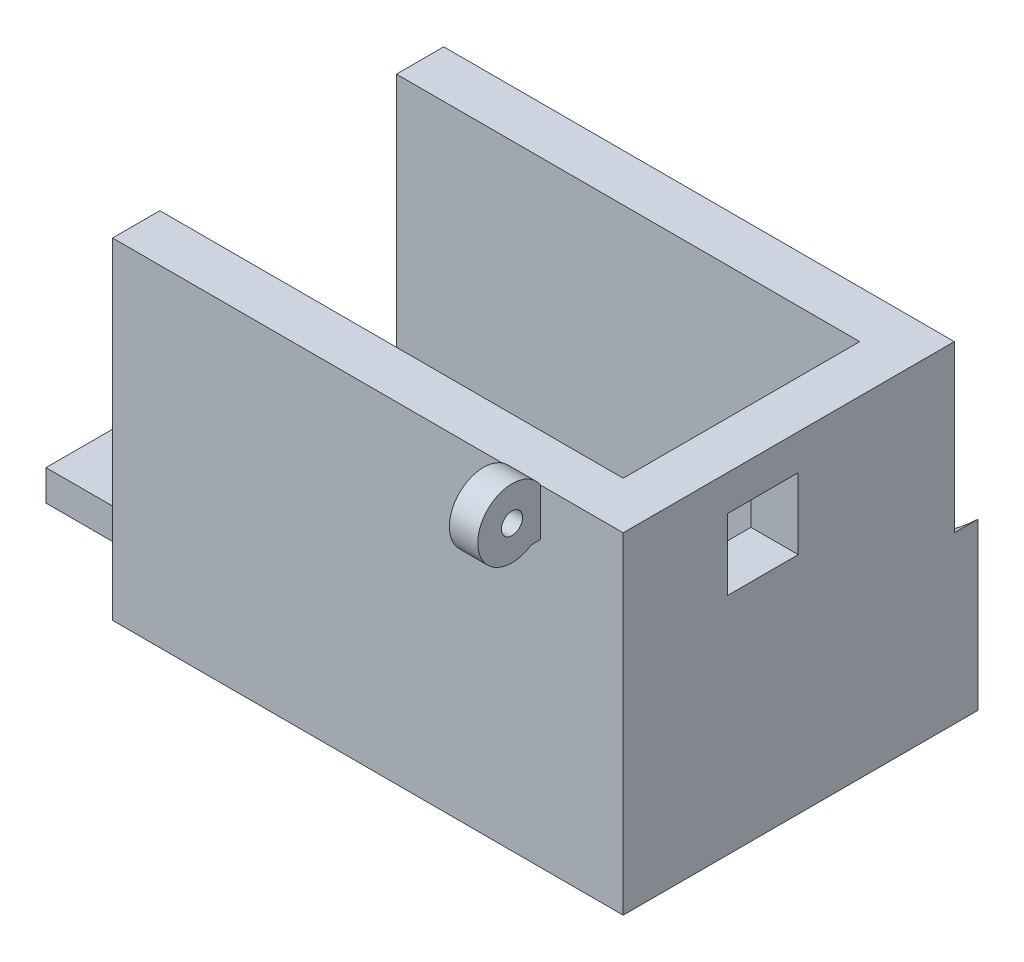
ISO-10303-21;
HEADER;
FILE_DESCRIPTION(('STEP AP214'),'2;1');
FILE_NAME('part.step','',(''),(''),'','','');
FILE_SCHEMA(('AUTOMOTIVE_DESIGN { 1 0 10303 214 1 1 1 1 }'));
ENDSEC;
DATA;
#1=APPLICATION_CONTEXT('core data for automotive mechanical design processes');
#2=APPLICATION_PROTOCOL_DEFINITION('international standard','automotive_design',2000,#1);
#3=PRODUCT_CONTEXT('',#1,'mechanical');
#4=PRODUCT('Part','Part','',(#3));
#5=PRODUCT_RELATED_PRODUCT_CATEGORY('part','',(#4));
#6=PRODUCT_DEFINITION_FORMATION('','',#4);
#7=PRODUCT_DEFINITION_CONTEXT('part definition',#1,'design');
#8=PRODUCT_DEFINITION('design','',#6,#7);
#9=PRODUCT_DEFINITION_SHAPE('','',#8);
#10=(LENGTH_UNIT() NAMED_UNIT(*) SI_UNIT(.MILLI.,.METRE.));
#11=(NAMED_UNIT(*) PLANE_ANGLE_UNIT() SI_UNIT($,.RADIAN.));
#12=(NAMED_UNIT(*) SI_UNIT($,.STERADIAN.) SOLID_ANGLE_UNIT());
#13=UNCERTAINTY_MEASURE_WITH_UNIT(LENGTH_MEASURE(1.E-05),#10,'distance_accuracy_value','');
#14=(GEOMETRIC_REPRESENTATION_CONTEXT(3) GLOBAL_UNCERTAINTY_ASSIGNED_CONTEXT((#13)) GLOBAL_UNIT_ASSIGNED_CONTEXT((#10,
#11,#12)) REPRESENTATION_CONTEXT('',''));
#15=CARTESIAN_POINT('',(0.,0.,0.));
#16=DIRECTION('',(0.,0.,1.));
#17=DIRECTION('',(1.,0.,0.));
#18=AXIS2_PLACEMENT_3D('',#15,#16,#17);
#19=CARTESIAN_POINT('',(162.536585365854,95.,33.3902439024391));
#20=DIRECTION('',(0.,0.,1.));
#21=DIRECTION('',(1.,0.,0.));
#22=AXIS2_PLACEMENT_3D('',#19,#20,#21);
#23=PLANE('',#22);
#24=DIRECTION('',(-1.,0.,0.));
#25=VECTOR('',#24,1.);
#26=CARTESIAN_POINT('',(162.536585365854,125.,33.3902439024391));
#27=LINE('',#26,#25);
#28=CARTESIAN_POINT('',(162.536585365854,125.,33.3902439024391));
#29=VERTEX_POINT('',#28);
#30=CARTESIAN_POINT('',(142.536585365854,125.,33.3902439024391));
#31=VERTEX_POINT('',#30);
#32=EDGE_CURVE('E54',#29,#31,#27,.T.);
#33=ORIENTED_EDGE('',*,*,#32,.F.);
#34=DIRECTION('',(0.,1.,0.));
#35=VECTOR('',#34,1.);
#36=CARTESIAN_POINT('',(162.536585365854,95.,33.3902439024391));
#37=LINE('',#36,#35);
#38=CARTESIAN_POINT('',(162.536585365854,95.,33.3902439024391));
#39=VERTEX_POINT('',#38);
#40=EDGE_CURVE('E195',#39,#29,#37,.T.);
#41=ORIENTED_EDGE('',*,*,#40,.F.);
#42=DIRECTION('',(-1.,0.,0.));
#43=VECTOR('',#42,1.);
#44=CARTESIAN_POINT('',(162.536585365854,95.,33.3902439024391));
#45=LINE('',#44,#43);
#46=CARTESIAN_POINT('',(142.536585365854,95.,33.3902439024391));
#47=VERTEX_POINT('',#46);
#48=EDGE_CURVE('E225',#39,#47,#45,.T.);
#49=ORIENTED_EDGE('',*,*,#48,.T.);
#50=DIRECTION('',(0.,1.,0.));
#51=VECTOR('',#50,1.);
#52=CARTESIAN_POINT('',(142.536585365854,95.,33.3902439024391));
#53=LINE('',#52,#51);
#54=EDGE_CURVE('E216',#47,#31,#53,.T.);
#55=ORIENTED_EDGE('',*,*,#54,.T.);
#56=EDGE_LOOP('',(#33,#41,#49,#55));
#57=FACE_BOUND('',#56,.T.);
#58=ADVANCED_FACE('F39',(#57),#23,.F.);
#59=CARTESIAN_POINT('',(162.536585365854,95.,3.39024390243907));
#60=DIRECTION('',(0.,0.,-1.));
#61=DIRECTION('',(-1.,0.,0.));
#62=AXIS2_PLACEMENT_3D('',#59,#60,#61);
#63=PLANE('',#62);
#64=DIRECTION('',(1.,0.,0.));
#65=VECTOR('',#64,1.);
#66=CARTESIAN_POINT('',(162.536585365854,125.,3.39024390243903));
#67=LINE('',#66,#65);
#68=CARTESIAN_POINT('',(142.536585365854,125.,3.39024390243907));
#69=VERTEX_POINT('',#68);
#70=CARTESIAN_POINT('',(162.536585365854,125.,3.39024390243903));
#71=VERTEX_POINT('',#70);
#72=EDGE_CURVE('E62',#69,#71,#67,.T.);
#73=ORIENTED_EDGE('',*,*,#72,.F.);
#74=DIRECTION('',(0.,-1.,0.));
#75=VECTOR('',#74,1.);
#76=CARTESIAN_POINT('',(142.536585365854,95.,3.39024390243907));
#77=LINE('',#76,#75);
#78=CARTESIAN_POINT('',(142.536585365854,95.,3.39024390243907));
#79=VERTEX_POINT('',#78);
#80=EDGE_CURVE('E221',#69,#79,#77,.T.);
#81=ORIENTED_EDGE('',*,*,#80,.T.);
#82=DIRECTION('',(-1.,0.,0.));
#83=VECTOR('',#82,1.);
#84=CARTESIAN_POINT('',(162.536585365854,95.,3.39024390243907));
#85=LINE('',#84,#83);
#86=CARTESIAN_POINT('',(162.536585365854,95.,3.39024390243907));
#87=VERTEX_POINT('',#86);
#88=EDGE_CURVE('E190',#87,#79,#85,.T.);
#89=ORIENTED_EDGE('',*,*,#88,.F.);
#90=DIRECTION('',(0.,-1.,0.));
#91=VECTOR('',#90,1.);
#92=CARTESIAN_POINT('',(162.536585365854,95.,3.39024390243907));
#93=LINE('',#92,#91);
#94=EDGE_CURVE('E186',#71,#87,#93,.T.);
#95=ORIENTED_EDGE('',*,*,#94,.F.);
#96=EDGE_LOOP('',(#73,#81,#89,#95));
#97=FACE_BOUND('',#96,.T.);
#98=ADVANCED_FACE('F188',(#97),#63,.F.);
#99=CARTESIAN_POINT('',(-203.343414634146,140.,-62.609756097561));
#100=DIRECTION('',(0.,0.,1.));
#101=DIRECTION('',(1.,0.,0.));
#102=AXIS2_PLACEMENT_3D('',#99,#100,#101);
#103=PLANE('',#102);
#104=CARTESIAN_POINT('',(-53.3434146341463,82.32,-62.609756097561));
#105=CARTESIAN_POINT('',(56.1531449954389,198.160876335363,-62.609756097561));
#106=CARTESIAN_POINT('',(74.6422908095103,-13.8218411745904,-62.609756097561));
#107=CARTESIAN_POINT('',(162.536585365854,70.,-62.609756097561));
#108=B_SPLINE_CURVE_WITH_KNOTS('',3,(#104,#105,#106,#107),.UNSPECIFIED.,.F.,.F.,(4,4),(0.,1.),.UNSPECIFIED.);
#109=CARTESIAN_POINT('',(-53.3434146341462,82.32,-62.609756097561));
#110=VERTEX_POINT('',#109);
#111=CARTESIAN_POINT('',(162.536585365854,70.,-62.609756097561));
#112=VERTEX_POINT('',#111);
#113=EDGE_CURVE('E227',#110,#112,#108,.T.);
#114=ORIENTED_EDGE('',*,*,#113,.F.);
#115=DIRECTION('',(0.,1.,0.));
#116=VECTOR('',#115,1.);
#117=CARTESIAN_POINT('',(-53.3434146341462,0.,-62.609756097561));
#118=LINE('',#117,#116);
#119=CARTESIAN_POINT('',(-53.3434146341462,140.,-62.609756097561));
#120=VERTEX_POINT('',#119);
#121=EDGE_CURVE('E383',#110,#120,#118,.T.);
#122=ORIENTED_EDGE('',*,*,#121,.T.);
#123=DIRECTION('',(-1.,0.,0.));
#124=VECTOR('',#123,1.);
#125=CARTESIAN_POINT('',(-203.343414634146,140.,-62.609756097561));
#126=LINE('',#125,#124);
#127=CARTESIAN_POINT('',(162.536585365854,140.,-62.609756097561));
#128=VERTEX_POINT('',#127);
#129=EDGE_CURVE('E453',#128,#120,#126,.T.);
#130=ORIENTED_EDGE('',*,*,#129,.F.);
#131=DIRECTION('',(0.,-1.,0.));
#132=VECTOR('',#131,1.);
#133=CARTESIAN_POINT('',(162.536585365854,140.,-62.609756097561));
#134=LINE('',#133,#132);
#135=EDGE_CURVE('E456',#128,#112,#134,.T.);
#136=ORIENTED_EDGE('',*,*,#135,.T.);
#137=EDGE_LOOP('',(#114,#122,#130,#136));
#138=FACE_BOUND('',#137,.T.);
#139=ADVANCED_FACE('F280',(#138),#103,.F.);
#140=CARTESIAN_POINT('',(-53.3434146341462,0.,77.3902439024391));
#141=DIRECTION('',(1.,0.,0.));
#142=DIRECTION('',(0.,0.,-1.));
#143=AXIS2_PLACEMENT_3D('',#140,#141,#142);
#144=PLANE('',#143);
#145=DIRECTION('',(0.,0.,-1.));
#146=VECTOR('',#145,1.);
#147=CARTESIAN_POINT('',(-53.3434146341462,140.,77.3902439024391));
#148=LINE('',#147,#146);
#149=CARTESIAN_POINT('',(-53.3434146341462,140.,-42.609756097561));
#150=VERTEX_POINT('',#149);
#151=EDGE_CURVE('E372',#150,#120,#148,.T.);
#152=ORIENTED_EDGE('',*,*,#151,.T.);
#153=ORIENTED_EDGE('',*,*,#121,.F.);
#154=DIRECTION('',(0.,0.,1.));
#155=VECTOR('',#154,1.);
#156=CARTESIAN_POINT('',(-53.3434146341463,82.32,-72.609756097561));
#157=LINE('',#156,#155);
#158=CARTESIAN_POINT('',(-53.3434146341463,82.32,-72.609756097561));
#159=VERTEX_POINT('',#158);
#160=EDGE_CURVE('E476',#159,#110,#157,.T.);
#161=ORIENTED_EDGE('',*,*,#160,.F.);
#162=DIRECTION('',(0.,1.,0.));
#163=VECTOR('',#162,1.);
#164=CARTESIAN_POINT('',(-53.3434146341462,0.,-72.609756097561));
#165=LINE('',#164,#163);
#166=CARTESIAN_POINT('',(-53.3434146341462,0.,-72.609756097561));
#167=VERTEX_POINT('',#166);
#168=EDGE_CURVE('E475',#167,#159,#165,.T.);
#169=ORIENTED_EDGE('',*,*,#168,.F.);
#170=DIRECTION('',(0.,0.,-1.));
#171=VECTOR('',#170,1.);
#172=CARTESIAN_POINT('',(-53.3434146341462,0.,77.3902439024391));
#173=LINE('',#172,#171);
#174=CARTESIAN_POINT('',(-53.3434146341462,0.,77.3902439024391));
#175=VERTEX_POINT('',#174);
#176=EDGE_CURVE('E378',#175,#167,#173,.T.);
#177=ORIENTED_EDGE('',*,*,#176,.F.);
#178=DIRECTION('',(0.,1.,0.));
#179=VECTOR('',#178,1.);
#180=CARTESIAN_POINT('',(-53.3434146341462,0.,77.3902439024391));
#181=LINE('',#180,#179);
#182=CARTESIAN_POINT('',(-53.3434146341462,140.,77.3902439024391));
#183=VERTEX_POINT('',#182);
#184=EDGE_CURVE('E380',#175,#183,#181,.T.);
#185=ORIENTED_EDGE('',*,*,#184,.T.);
#186=CARTESIAN_POINT('',(-53.3434146341462,140.,57.390243902439));
#187=VERTEX_POINT('',#186);
#188=EDGE_CURVE('E381',#183,#187,#148,.T.);
#189=ORIENTED_EDGE('',*,*,#188,.T.);
#190=DIRECTION('',(0.,1.,0.));
#191=VECTOR('',#190,1.);
#192=CARTESIAN_POINT('',(-53.3434146341462,30.,57.390243902439));
#193=LINE('',#192,#191);
#194=CARTESIAN_POINT('',(-53.3434146341463,30.,57.390243902439));
#195=VERTEX_POINT('',#194);
#196=EDGE_CURVE('E385',#195,#187,#193,.T.);
#197=ORIENTED_EDGE('',*,*,#196,.F.);
#198=DIRECTION('',(0.,0.,-1.));
#199=VECTOR('',#198,1.);
#200=CARTESIAN_POINT('',(-53.3434146341462,30.,0.));
#201=LINE('',#200,#199);
#202=CARTESIAN_POINT('',(-53.3434146341462,30.,-42.609756097561));
#203=VERTEX_POINT('',#202);
#204=EDGE_CURVE('E12',#195,#203,#201,.T.);
#205=ORIENTED_EDGE('',*,*,#204,.T.);
#206=DIRECTION('',(0.,-1.,0.));
#207=VECTOR('',#206,1.);
#208=CARTESIAN_POINT('',(-53.3434146341462,30.,-42.609756097561));
#209=LINE('',#208,#207);
#210=EDGE_CURVE('E389',#150,#203,#209,.T.);
#211=ORIENTED_EDGE('',*,*,#210,.F.);
#212=EDGE_LOOP('',(#152,#153,#161,#169,#177,#185,#189,#197,#205,#211));
#213=FACE_BOUND('',#212,.T.);
#214=DIRECTION('',(0.,-1.,0.));
#215=VECTOR('',#214,1.);
#216=CARTESIAN_POINT('',(-53.3434146341462,20.,-42.609756097561));
#217=LINE('',#216,#215);
#218=CARTESIAN_POINT('',(-53.3434146341462,20.,-42.609756097561));
#219=VERTEX_POINT('',#218);
#220=CARTESIAN_POINT('',(-53.3434146341462,7.,-42.609756097561));
#221=VERTEX_POINT('',#220);
#222=EDGE_CURVE('E364',#219,#221,#217,.T.);
#223=ORIENTED_EDGE('',*,*,#222,.F.);
#224=DIRECTION('',(0.,0.,-1.));
#225=VECTOR('',#224,1.);
#226=CARTESIAN_POINT('',(-53.3434146341462,20.,-42.609756097561));
#227=LINE('',#226,#225);
#228=CARTESIAN_POINT('',(-53.3434146341462,20.,55.5296286532583));
#229=VERTEX_POINT('',#228);
#230=EDGE_CURVE('E501',#229,#219,#227,.T.);
#231=ORIENTED_EDGE('',*,*,#230,.F.);
#232=DIRECTION('',(0.,1.,0.));
#233=VECTOR('',#232,1.);
#234=CARTESIAN_POINT('',(-53.3434146341462,20.,55.5296286532583));
#235=LINE('',#234,#233);
#236=CARTESIAN_POINT('',(-53.3434146341462,7.,55.5296286532583));
#237=VERTEX_POINT('',#236);
#238=EDGE_CURVE('E363',#237,#229,#235,.T.);
#239=ORIENTED_EDGE('',*,*,#238,.F.);
#240=DIRECTION('',(0.,0.,1.));
#241=VECTOR('',#240,1.);
#242=CARTESIAN_POINT('',(-53.3434146341462,7.,-42.609756097561));
#243=LINE('',#242,#241);
#244=EDGE_CURVE('E355',#221,#237,#243,.T.);
#245=ORIENTED_EDGE('',*,*,#244,.F.);
#246=EDGE_LOOP('',(#223,#231,#239,#245));
#247=FACE_BOUND('',#246,.T.);
#248=ADVANCED_FACE('F277',(#213,#247),#144,.F.);
#249=CARTESIAN_POINT('',(-203.343414634146,140.,77.3902439024391));
#250=DIRECTION('',(0.,0.,-1.));
#251=DIRECTION('',(-1.,0.,0.));
#252=AXIS2_PLACEMENT_3D('',#249,#250,#251);
#253=PLANE('',#252);
#254=DIRECTION('',(1.,0.,0.));
#255=VECTOR('',#254,1.);
#256=CARTESIAN_POINT('',(-203.343414634146,140.,77.3902439024391));
#257=LINE('',#256,#255);
#258=CARTESIAN_POINT('',(115.536585365854,140.,77.3902439024391));
#259=VERTEX_POINT('',#258);
#260=EDGE_CURVE('E448',#183,#259,#257,.T.);
#261=ORIENTED_EDGE('',*,*,#260,.F.);
#262=ORIENTED_EDGE('',*,*,#184,.F.);
#263=DIRECTION('',(1.,0.,0.));
#264=VECTOR('',#263,1.);
#265=CARTESIAN_POINT('',(-203.343414634146,0.,77.3902439024391));
#266=LINE('',#265,#264);
#267=CARTESIAN_POINT('',(162.536585365854,0.,77.3902439024391));
#268=VERTEX_POINT('',#267);
#269=EDGE_CURVE('E445',#175,#268,#266,.T.);
#270=ORIENTED_EDGE('',*,*,#269,.T.);
#271=DIRECTION('',(0.,-1.,0.));
#272=VECTOR('',#271,1.);
#273=CARTESIAN_POINT('',(162.536585365854,140.,77.3902439024391));
#274=LINE('',#273,#272);
#275=CARTESIAN_POINT('',(162.536585365854,140.,77.3902439024391));
#276=VERTEX_POINT('',#275);
#277=EDGE_CURVE('E47',#276,#268,#274,.T.);
#278=ORIENTED_EDGE('',*,*,#277,.F.);
#279=CARTESIAN_POINT('',(127.536585365854,140.,77.3902439024391));
#280=VERTEX_POINT('',#279);
#281=EDGE_CURVE('E451',#280,#276,#257,.T.);
#282=ORIENTED_EDGE('',*,*,#281,.F.);
#283=DIRECTION('',(0.,1.,0.));
#284=VECTOR('',#283,1.);
#285=CARTESIAN_POINT('',(127.536585365854,132.,77.3902439024391));
#286=LINE('',#285,#284);
#287=CARTESIAN_POINT('',(127.536585365854,120.,77.3902439024391));
#288=VERTEX_POINT('',#287);
#289=EDGE_CURVE('E419',#288,#280,#286,.T.);
#290=ORIENTED_EDGE('',*,*,#289,.F.);
#291=DIRECTION('',(1.,0.,0.));
#292=VECTOR('',#291,1.);
#293=CARTESIAN_POINT('',(115.536585365854,120.,77.3902439024391));
#294=LINE('',#293,#292);
#295=CARTESIAN_POINT('',(115.536585365854,120.,77.3902439024391));
#296=VERTEX_POINT('',#295);
#297=EDGE_CURVE('E416',#296,#288,#294,.T.);
#298=ORIENTED_EDGE('',*,*,#297,.F.);
#299=DIRECTION('',(0.,-1.,0.));
#300=VECTOR('',#299,1.);
#301=CARTESIAN_POINT('',(115.536585365854,132.,77.3902439024391));
#302=LINE('',#301,#300);
#303=EDGE_CURVE('E414',#259,#296,#302,.T.);
#304=ORIENTED_EDGE('',*,*,#303,.F.);
#305=EDGE_LOOP('',(#261,#262,#270,#278,#282,#290,#298,#304));
#306=FACE_BOUND('',#305,.T.);
#307=ADVANCED_FACE('F41',(#306),#253,.F.);
#308=CARTESIAN_POINT('',(0.,140.,0.));
#309=DIRECTION('',(0.,1.,0.));
#310=DIRECTION('',(0.,0.,1.));
#311=AXIS2_PLACEMENT_3D('',#308,#309,#310);
#312=PLANE('',#311);
#313=DIRECTION('',(-1.,0.,0.));
#314=VECTOR('',#313,1.);
#315=CARTESIAN_POINT('',(-203.343414634146,140.,-42.609756097561));
#316=LINE('',#315,#314);
#317=CARTESIAN_POINT('',(142.536585365854,140.,-42.609756097561));
#318=VERTEX_POINT('',#317);
#319=EDGE_CURVE('E430',#318,#150,#316,.T.);
#320=ORIENTED_EDGE('',*,*,#319,.F.);
#321=DIRECTION('',(0.,0.,-1.));
#322=VECTOR('',#321,1.);
#323=CARTESIAN_POINT('',(142.536585365854,140.,-42.609756097561));
#324=LINE('',#323,#322);
#325=CARTESIAN_POINT('',(142.536585365854,140.,57.390243902439));
#326=VERTEX_POINT('',#325);
#327=EDGE_CURVE('E438',#326,#318,#324,.T.);
#328=ORIENTED_EDGE('',*,*,#327,.F.);
#329=DIRECTION('',(1.,0.,0.));
#330=VECTOR('',#329,1.);
#331=CARTESIAN_POINT('',(-203.343414634146,140.,57.390243902439));
#332=LINE('',#331,#330);
#333=EDGE_CURVE('E426',#187,#326,#332,.T.);
#334=ORIENTED_EDGE('',*,*,#333,.F.);
#335=ORIENTED_EDGE('',*,*,#188,.F.);
#336=ORIENTED_EDGE('',*,*,#260,.T.);
#337=DIRECTION('',(0.,0.,-1.));
#338=VECTOR('',#337,1.);
#339=CARTESIAN_POINT('',(115.536585365854,140.,0.));
#340=LINE('',#339,#338);
#341=CARTESIAN_POINT('',(115.536585365854,140.,77.3088491154122));
#342=VERTEX_POINT('',#341);
#343=EDGE_CURVE('E406',#259,#342,#340,.T.);
#344=ORIENTED_EDGE('',*,*,#343,.T.);
#345=DIRECTION('',(1.,0.,0.));
#346=VECTOR('',#345,1.);
#347=CARTESIAN_POINT('',(115.536585365854,140.,77.3088491154122));
#348=LINE('',#347,#346);
#349=CARTESIAN_POINT('',(127.536585365854,140.,77.3088491154122));
#350=VERTEX_POINT('',#349);
#351=EDGE_CURVE('E411',#350,#342,#348,.F.);
#352=ORIENTED_EDGE('',*,*,#351,.F.);
#353=DIRECTION('',(0.,0.,-1.));
#354=VECTOR('',#353,1.);
#355=CARTESIAN_POINT('',(127.536585365854,140.,0.));
#356=LINE('',#355,#354);
#357=EDGE_CURVE('E401',#280,#350,#356,.T.);
#358=ORIENTED_EDGE('',*,*,#357,.F.);
#359=ORIENTED_EDGE('',*,*,#281,.T.);
#360=DIRECTION('',(0.,0.,-1.));
#361=VECTOR('',#360,1.);
#362=CARTESIAN_POINT('',(162.536585365854,140.,-62.609756097561));
#363=LINE('',#362,#361);
#364=EDGE_CURVE('E450',#276,#128,#363,.T.);
#365=ORIENTED_EDGE('',*,*,#364,.T.);
#366=ORIENTED_EDGE('',*,*,#129,.T.);
#367=ORIENTED_EDGE('',*,*,#151,.F.);
#368=EDGE_LOOP('',(#320,#328,#334,#335,#336,#344,#352,#358,#359,#365,#366,#367));
#369=FACE_BOUND('',#368,.T.);
#370=ADVANCED_FACE('F318',(#369),#312,.T.);
#371=CARTESIAN_POINT('',(162.536585365854,140.,-62.609756097561));
#372=DIRECTION('',(-1.,0.,0.));
#373=DIRECTION('',(0.,0.,1.));
#374=AXIS2_PLACEMENT_3D('',#371,#372,#373);
#375=PLANE('',#374);
#376=ORIENTED_EDGE('',*,*,#40,.T.);
#377=DIRECTION('',(0.,0.,-1.));
#378=VECTOR('',#377,1.);
#379=CARTESIAN_POINT('',(162.536585365854,125.,43.390243902439));
#380=LINE('',#379,#378);
#381=EDGE_CURVE('E198',#29,#71,#380,.T.);
#382=ORIENTED_EDGE('',*,*,#381,.T.);
#383=ORIENTED_EDGE('',*,*,#94,.T.);
#384=DIRECTION('',(0.,0.,1.));
#385=VECTOR('',#384,1.);
#386=CARTESIAN_POINT('',(162.536585365854,95.,3.39024390243907));
#387=LINE('',#386,#385);
#388=EDGE_CURVE('E194',#87,#39,#387,.T.);
#389=ORIENTED_EDGE('',*,*,#388,.T.);
#390=EDGE_LOOP('',(#376,#382,#383,#389));
#391=FACE_BOUND('',#390,.T.);
#392=ORIENTED_EDGE('',*,*,#135,.F.);
#393=ORIENTED_EDGE('',*,*,#364,.F.);
#394=ORIENTED_EDGE('',*,*,#277,.T.);
#395=DIRECTION('',(0.,0.,-1.));
#396=VECTOR('',#395,1.);
#397=CARTESIAN_POINT('',(162.536585365854,0.,-62.609756097561));
#398=LINE('',#397,#396);
#399=CARTESIAN_POINT('',(162.536585365854,0.,-72.609756097561));
#400=VERTEX_POINT('',#399);
#401=EDGE_CURVE('E458',#268,#400,#398,.T.);
#402=ORIENTED_EDGE('',*,*,#401,.T.);
#403=DIRECTION('',(0.,-1.,0.));
#404=VECTOR('',#403,1.);
#405=CARTESIAN_POINT('',(162.536585365854,70.,-72.609756097561));
#406=LINE('',#405,#404);
#407=CARTESIAN_POINT('',(162.536585365854,70.,-72.609756097561));
#408=VERTEX_POINT('',#407);
#409=EDGE_CURVE('E235',#408,#400,#406,.T.);
#410=ORIENTED_EDGE('',*,*,#409,.F.);
#411=DIRECTION('',(0.,0.,1.));
#412=VECTOR('',#411,1.);
#413=CARTESIAN_POINT('',(162.536585365854,70.,-72.609756097561));
#414=LINE('',#413,#412);
#415=EDGE_CURVE('E488',#408,#112,#414,.T.);
#416=ORIENTED_EDGE('',*,*,#415,.T.);
#417=EDGE_LOOP('',(#392,#393,#394,#402,#410,#416));
#418=FACE_BOUND('',#417,.T.);
#419=ADVANCED_FACE('F199',(#391,#418),#375,.F.);
#420=CARTESIAN_POINT('',(0.,0.,0.));
#421=DIRECTION('',(0.,1.,0.));
#422=DIRECTION('',(0.,0.,1.));
#423=AXIS2_PLACEMENT_3D('',#420,#421,#422);
#424=PLANE('',#423);
#425=CARTESIAN_POINT('',(10.5365853658537,0.,7.39024390243905));
#426=DIRECTION('',(0.,1.,0.));
#427=DIRECTION('',(0.,0.,1.));
#428=AXIS2_PLACEMENT_3D('',#425,#426,#427);
#429=CIRCLE('',#428,3.);
#430=CARTESIAN_POINT('',(10.5365853658537,0.,10.390243902439));
#431=VERTEX_POINT('',#430);
#432=EDGE_CURVE('E492',#431,#431,#429,.T.);
#433=ORIENTED_EDGE('',*,*,#432,.T.);
#434=EDGE_LOOP('',(#433));
#435=FACE_BOUND('',#434,.T.);
#436=ORIENTED_EDGE('',*,*,#269,.F.);
#437=ORIENTED_EDGE('',*,*,#176,.T.);
#438=DIRECTION('',(-1.,0.,0.));
#439=VECTOR('',#438,1.);
#440=CARTESIAN_POINT('',(162.536585365854,0.,-72.609756097561));
#441=LINE('',#440,#439);
#442=EDGE_CURVE('E472',#400,#167,#441,.T.);
#443=ORIENTED_EDGE('',*,*,#442,.F.);
#444=ORIENTED_EDGE('',*,*,#401,.F.);
#445=EDGE_LOOP('',(#436,#437,#443,#444));
#446=FACE_BOUND('',#445,.T.);
#447=ADVANCED_FACE('F310',(#435,#446),#424,.F.);
#448=CARTESIAN_POINT('',(-203.343414634146,30.,-42.609756097561));
#449=DIRECTION('',(0.,0.,-1.));
#450=DIRECTION('',(-1.,0.,0.));
#451=AXIS2_PLACEMENT_3D('',#448,#449,#450);
#452=PLANE('',#451);
#453=ORIENTED_EDGE('',*,*,#319,.T.);
#454=ORIENTED_EDGE('',*,*,#210,.T.);
#455=DIRECTION('',(-1.,0.,0.));
#456=VECTOR('',#455,1.);
#457=CARTESIAN_POINT('',(-203.343414634146,30.,-42.609756097561));
#458=LINE('',#457,#456);
#459=CARTESIAN_POINT('',(142.536585365854,30.,-42.609756097561));
#460=VERTEX_POINT('',#459);
#461=EDGE_CURVE('E433',#460,#203,#458,.T.);
#462=ORIENTED_EDGE('',*,*,#461,.F.);
#463=DIRECTION('',(0.,1.,0.));
#464=VECTOR('',#463,1.);
#465=CARTESIAN_POINT('',(142.536585365854,30.,-42.609756097561));
#466=LINE('',#465,#464);
#467=EDGE_CURVE('E442',#460,#318,#466,.T.);
#468=ORIENTED_EDGE('',*,*,#467,.T.);
#469=EDGE_LOOP('',(#453,#454,#462,#468));
#470=FACE_BOUND('',#469,.T.);
#471=ADVANCED_FACE('F306',(#470),#452,.F.);
#472=CARTESIAN_POINT('',(142.536585365854,30.,-42.609756097561));
#473=DIRECTION('',(1.,0.,0.));
#474=DIRECTION('',(0.,0.,-1.));
#475=AXIS2_PLACEMENT_3D('',#472,#473,#474);
#476=PLANE('',#475);
#477=DIRECTION('',(0.,0.,-1.));
#478=VECTOR('',#477,1.);
#479=CARTESIAN_POINT('',(142.536585365854,125.,43.390243902439));
#480=LINE('',#479,#478);
#481=EDGE_CURVE('E202',#31,#69,#480,.T.);
#482=ORIENTED_EDGE('',*,*,#481,.F.);
#483=ORIENTED_EDGE('',*,*,#54,.F.);
#484=DIRECTION('',(0.,0.,1.));
#485=VECTOR('',#484,1.);
#486=CARTESIAN_POINT('',(142.536585365854,95.,3.39024390243907));
#487=LINE('',#486,#485);
#488=EDGE_CURVE('E217',#79,#47,#487,.T.);
#489=ORIENTED_EDGE('',*,*,#488,.F.);
#490=ORIENTED_EDGE('',*,*,#80,.F.);
#491=EDGE_LOOP('',(#482,#483,#489,#490));
#492=FACE_BOUND('',#491,.T.);
#493=ORIENTED_EDGE('',*,*,#327,.T.);
#494=ORIENTED_EDGE('',*,*,#467,.F.);
#495=DIRECTION('',(0.,0.,-1.));
#496=VECTOR('',#495,1.);
#497=CARTESIAN_POINT('',(142.536585365854,30.,-42.609756097561));
#498=LINE('',#497,#496);
#499=CARTESIAN_POINT('',(142.536585365854,30.,57.390243902439));
#500=VERTEX_POINT('',#499);
#501=EDGE_CURVE('E429',#500,#460,#498,.T.);
#502=ORIENTED_EDGE('',*,*,#501,.F.);
#503=DIRECTION('',(0.,1.,0.));
#504=VECTOR('',#503,1.);
#505=CARTESIAN_POINT('',(142.536585365854,30.,57.390243902439));
#506=LINE('',#505,#504);
#507=EDGE_CURVE('E436',#500,#326,#506,.T.);
#508=ORIENTED_EDGE('',*,*,#507,.T.);
#509=EDGE_LOOP('',(#493,#494,#502,#508));
#510=FACE_BOUND('',#509,.T.);
#511=ADVANCED_FACE('F309',(#492,#510),#476,.F.);
#512=CARTESIAN_POINT('',(-203.343414634146,30.,57.390243902439));
#513=DIRECTION('',(0.,0.,1.));
#514=DIRECTION('',(1.,0.,0.));
#515=AXIS2_PLACEMENT_3D('',#512,#513,#514);
#516=PLANE('',#515);
#517=DIRECTION('',(1.,0.,0.));
#518=VECTOR('',#517,1.);
#519=CARTESIAN_POINT('',(-203.343414634146,30.,57.390243902439));
#520=LINE('',#519,#518);
#521=EDGE_CURVE('E427',#195,#500,#520,.T.);
#522=ORIENTED_EDGE('',*,*,#521,.F.);
#523=ORIENTED_EDGE('',*,*,#196,.T.);
#524=ORIENTED_EDGE('',*,*,#333,.T.);
#525=ORIENTED_EDGE('',*,*,#507,.F.);
#526=EDGE_LOOP('',(#522,#523,#524,#525));
#527=FACE_BOUND('',#526,.T.);
#528=ADVANCED_FACE('F304',(#527),#516,.F.);
#529=CARTESIAN_POINT('',(0.,30.,0.));
#530=DIRECTION('',(0.,1.,0.));
#531=DIRECTION('',(0.,0.,1.));
#532=AXIS2_PLACEMENT_3D('',#529,#530,#531);
#533=PLANE('',#532);
#534=ORIENTED_EDGE('',*,*,#204,.F.);
#535=ORIENTED_EDGE('',*,*,#521,.T.);
#536=ORIENTED_EDGE('',*,*,#501,.T.);
#537=ORIENTED_EDGE('',*,*,#461,.T.);
#538=EDGE_LOOP('',(#534,#535,#536,#537));
#539=FACE_BOUND('',#538,.T.);
#540=ADVANCED_FACE('F300',(#539),#533,.T.);
#541=CARTESIAN_POINT('',(115.536585365854,132.,87.3902439024391));
#542=DIRECTION('',(1.,0.,0.));
#543=DIRECTION('',(0.,0.,-1.));
#544=AXIS2_PLACEMENT_3D('',#541,#542,#543);
#545=PLANE('',#544);
#546=DIRECTION('',(0.,0.,-1.));
#547=VECTOR('',#546,1.);
#548=CARTESIAN_POINT('',(115.536585365854,120.,87.3902439024391));
#549=LINE('',#548,#547);
#550=CARTESIAN_POINT('',(115.536585365854,120.,81.2686615443022));
#551=VERTEX_POINT('',#550);
#552=EDGE_CURVE('E423',#551,#296,#549,.T.);
#553=ORIENTED_EDGE('',*,*,#552,.F.);
#554=CARTESIAN_POINT('',(115.536585365854,132.,89.3902439024391));
#555=DIRECTION('',(1.,0.,0.));
#556=DIRECTION('',(0.,0.,-1.));
#557=AXIS2_PLACEMENT_3D('',#554,#555,#556);
#558=CIRCLE('',#557,14.49);
#559=EDGE_CURVE('E399',#342,#551,#558,.T.);
#560=ORIENTED_EDGE('',*,*,#559,.F.);
#561=ORIENTED_EDGE('',*,*,#343,.F.);
#562=ORIENTED_EDGE('',*,*,#303,.T.);
#563=EDGE_LOOP('',(#553,#560,#561,#562));
#564=FACE_BOUND('',#563,.T.);
#565=CARTESIAN_POINT('',(115.536585365854,132.,89.3902439024391));
#566=DIRECTION('',(1.,0.,0.));
#567=DIRECTION('',(0.,0.,-1.));
#568=AXIS2_PLACEMENT_3D('',#565,#566,#567);
#569=CIRCLE('',#568,4.48999999999999);
#570=CARTESIAN_POINT('',(115.536585365854,132.,84.9002439024391));
#571=VERTEX_POINT('',#570);
#572=EDGE_CURVE('E393',#571,#571,#569,.T.);
#573=ORIENTED_EDGE('',*,*,#572,.T.);
#574=EDGE_LOOP('',(#573));
#575=FACE_BOUND('',#574,.T.);
#576=ADVANCED_FACE('F296',(#564,#575),#545,.F.);
#577=CARTESIAN_POINT('',(115.536585365854,120.,87.3902439024391));
#578=DIRECTION('',(0.,1.,0.));
#579=DIRECTION('',(0.,0.,1.));
#580=AXIS2_PLACEMENT_3D('',#577,#578,#579);
#581=PLANE('',#580);
#582=DIRECTION('',(0.,0.,-1.));
#583=VECTOR('',#582,1.);
#584=CARTESIAN_POINT('',(127.536585365854,120.,87.3902439024391));
#585=LINE('',#584,#583);
#586=CARTESIAN_POINT('',(127.536585365854,120.,81.2686615443022));
#587=VERTEX_POINT('',#586);
#588=EDGE_CURVE('E421',#587,#288,#585,.T.);
#589=ORIENTED_EDGE('',*,*,#588,.F.);
#590=DIRECTION('',(1.,0.,0.));
#591=VECTOR('',#590,1.);
#592=CARTESIAN_POINT('',(115.536585365854,120.,81.2686615443022));
#593=LINE('',#592,#591);
#594=EDGE_CURVE('E408',#587,#551,#593,.F.);
#595=ORIENTED_EDGE('',*,*,#594,.T.);
#596=ORIENTED_EDGE('',*,*,#552,.T.);
#597=ORIENTED_EDGE('',*,*,#297,.T.);
#598=EDGE_LOOP('',(#589,#595,#596,#597));
#599=FACE_BOUND('',#598,.T.);
#600=ADVANCED_FACE('F292',(#599),#581,.F.);
#601=CARTESIAN_POINT('',(127.536585365854,132.,87.3902439024391));
#602=DIRECTION('',(-1.,0.,0.));
#603=DIRECTION('',(0.,0.,1.));
#604=AXIS2_PLACEMENT_3D('',#601,#602,#603);
#605=PLANE('',#604);
#606=CARTESIAN_POINT('',(127.536585365854,132.,89.3902439024391));
#607=DIRECTION('',(1.,0.,0.));
#608=DIRECTION('',(0.,0.,-1.));
#609=AXIS2_PLACEMENT_3D('',#606,#607,#608);
#610=CIRCLE('',#609,14.49);
#611=EDGE_CURVE('E396',#350,#587,#610,.T.);
#612=ORIENTED_EDGE('',*,*,#611,.T.);
#613=ORIENTED_EDGE('',*,*,#588,.T.);
#614=ORIENTED_EDGE('',*,*,#289,.T.);
#615=ORIENTED_EDGE('',*,*,#357,.T.);
#616=EDGE_LOOP('',(#612,#613,#614,#615));
#617=FACE_BOUND('',#616,.T.);
#618=CARTESIAN_POINT('',(127.536585365854,132.,89.3902439024391));
#619=DIRECTION('',(1.,0.,0.));
#620=DIRECTION('',(0.,0.,-1.));
#621=AXIS2_PLACEMENT_3D('',#618,#619,#620);
#622=CIRCLE('',#621,4.48999999999999);
#623=CARTESIAN_POINT('',(127.536585365854,132.,84.9002439024391));
#624=VERTEX_POINT('',#623);
#625=EDGE_CURVE('E392',#624,#624,#622,.T.);
#626=ORIENTED_EDGE('',*,*,#625,.F.);
#627=EDGE_LOOP('',(#626));
#628=FACE_BOUND('',#627,.T.);
#629=ADVANCED_FACE('F285',(#617,#628),#605,.F.);
#630=CARTESIAN_POINT('',(115.536585365854,132.,89.3902439024391));
#631=DIRECTION('',(1.,0.,0.));
#632=DIRECTION('',(0.,0.,-1.));
#633=AXIS2_PLACEMENT_3D('',#630,#631,#632);
#634=CYLINDRICAL_SURFACE('',#633,4.48999999999999);
#635=ORIENTED_EDGE('',*,*,#625,.T.);
#636=EDGE_LOOP('',(#635));
#637=FACE_BOUND('',#636,.T.);
#638=ORIENTED_EDGE('',*,*,#572,.F.);
#639=EDGE_LOOP('',(#638));
#640=FACE_BOUND('',#639,.T.);
#641=ADVANCED_FACE('F282',(#637,#640),#634,.F.);
#642=CARTESIAN_POINT('',(115.536585365854,132.,89.3902439024391));
#643=DIRECTION('',(1.,0.,0.));
#644=DIRECTION('',(0.,0.,-1.));
#645=AXIS2_PLACEMENT_3D('',#642,#643,#644);
#646=CYLINDRICAL_SURFACE('',#645,14.49);
#647=ORIENTED_EDGE('',*,*,#611,.F.);
#648=ORIENTED_EDGE('',*,*,#351,.T.);
#649=ORIENTED_EDGE('',*,*,#559,.T.);
#650=ORIENTED_EDGE('',*,*,#594,.F.);
#651=EDGE_LOOP('',(#647,#648,#649,#650));
#652=FACE_BOUND('',#651,.T.);
#653=ADVANCED_FACE('F275',(#652),#646,.T.);
#654=CARTESIAN_POINT('',(-103.343414634146,20.,-42.609756097561));
#655=DIRECTION('',(0.,0.,1.));
#656=DIRECTION('',(1.,0.,0.));
#657=AXIS2_PLACEMENT_3D('',#654,#655,#656);
#658=PLANE('',#657);
#659=ORIENTED_EDGE('',*,*,#222,.T.);
#660=DIRECTION('',(1.,0.,0.));
#661=VECTOR('',#660,1.);
#662=CARTESIAN_POINT('',(-103.343414634146,7.,-42.609756097561));
#663=LINE('',#662,#661);
#664=CARTESIAN_POINT('',(-103.343414634146,7.,-42.609756097561));
#665=VERTEX_POINT('',#664);
#666=EDGE_CURVE('E360',#665,#221,#663,.T.);
#667=ORIENTED_EDGE('',*,*,#666,.F.);
#668=DIRECTION('',(0.,-1.,0.));
#669=VECTOR('',#668,1.);
#670=CARTESIAN_POINT('',(-103.343414634146,20.,-42.609756097561));
#671=LINE('',#670,#669);
#672=CARTESIAN_POINT('',(-103.343414634146,20.,-42.609756097561));
#673=VERTEX_POINT('',#672);
#674=EDGE_CURVE('E497',#673,#665,#671,.T.);
#675=ORIENTED_EDGE('',*,*,#674,.F.);
#676=DIRECTION('',(1.,0.,0.));
#677=VECTOR('',#676,1.);
#678=CARTESIAN_POINT('',(-103.343414634146,20.,-42.609756097561));
#679=LINE('',#678,#677);
#680=EDGE_CURVE('E374',#673,#219,#679,.T.);
#681=ORIENTED_EDGE('',*,*,#680,.T.);
#682=EDGE_LOOP('',(#659,#667,#675,#681));
#683=FACE_BOUND('',#682,.T.);
#684=ADVANCED_FACE('F271',(#683),#658,.F.);
#685=CARTESIAN_POINT('',(-103.343414634146,7.,-42.609756097561));
#686=DIRECTION('',(0.,1.,0.));
#687=DIRECTION('',(0.,0.,1.));
#688=AXIS2_PLACEMENT_3D('',#685,#686,#687);
#689=PLANE('',#688);
#690=CARTESIAN_POINT('',(-83.3434146341463,7.,7.39024390243905));
#691=DIRECTION('',(0.,1.,0.));
#692=DIRECTION('',(0.,0.,1.));
#693=AXIS2_PLACEMENT_3D('',#690,#691,#692);
#694=CIRCLE('',#693,3.00000000000001);
#695=CARTESIAN_POINT('',(-83.3434146341463,7.,10.3902439024391));
#696=VERTEX_POINT('',#695);
#697=EDGE_CURVE('E207',#696,#696,#694,.T.);
#698=ORIENTED_EDGE('',*,*,#697,.T.);
#699=EDGE_LOOP('',(#698));
#700=FACE_BOUND('',#699,.T.);
#701=ORIENTED_EDGE('',*,*,#244,.T.);
#702=DIRECTION('',(1.,0.,0.));
#703=VECTOR('',#702,1.);
#704=CARTESIAN_POINT('',(-103.343414634146,7.,55.5296286532583));
#705=LINE('',#704,#703);
#706=CARTESIAN_POINT('',(-103.343414634146,7.,55.5296286532583));
#707=VERTEX_POINT('',#706);
#708=EDGE_CURVE('E357',#707,#237,#705,.T.);
#709=ORIENTED_EDGE('',*,*,#708,.F.);
#710=DIRECTION('',(0.,0.,1.));
#711=VECTOR('',#710,1.);
#712=CARTESIAN_POINT('',(-103.343414634146,7.,-42.609756097561));
#713=LINE('',#712,#711);
#714=EDGE_CURVE('E500',#665,#707,#713,.T.);
#715=ORIENTED_EDGE('',*,*,#714,.F.);
#716=ORIENTED_EDGE('',*,*,#666,.T.);
#717=EDGE_LOOP('',(#701,#709,#715,#716));
#718=FACE_BOUND('',#717,.T.);
#719=ADVANCED_FACE('F267',(#700,#718),#689,.F.);
#720=CARTESIAN_POINT('',(-103.343414634146,20.,55.5296286532583));
#721=DIRECTION('',(0.,0.,-1.));
#722=DIRECTION('',(-1.,0.,0.));
#723=AXIS2_PLACEMENT_3D('',#720,#721,#722);
#724=PLANE('',#723);
#725=ORIENTED_EDGE('',*,*,#238,.T.);
#726=DIRECTION('',(1.,0.,0.));
#727=VECTOR('',#726,1.);
#728=CARTESIAN_POINT('',(-103.343414634146,20.,55.5296286532583));
#729=LINE('',#728,#727);
#730=CARTESIAN_POINT('',(-103.343414634146,20.,55.5296286532583));
#731=VERTEX_POINT('',#730);
#732=EDGE_CURVE('E370',#731,#229,#729,.T.);
#733=ORIENTED_EDGE('',*,*,#732,.F.);
#734=DIRECTION('',(0.,1.,0.));
#735=VECTOR('',#734,1.);
#736=CARTESIAN_POINT('',(-103.343414634146,20.,55.5296286532583));
#737=LINE('',#736,#735);
#738=EDGE_CURVE('E369',#707,#731,#737,.T.);
#739=ORIENTED_EDGE('',*,*,#738,.F.);
#740=ORIENTED_EDGE('',*,*,#708,.T.);
#741=EDGE_LOOP('',(#725,#733,#739,#740));
#742=FACE_BOUND('',#741,.T.);
#743=ADVANCED_FACE('F263',(#742),#724,.F.);
#744=CARTESIAN_POINT('',(-103.343414634146,20.,-42.609756097561));
#745=DIRECTION('',(0.,-1.,0.));
#746=DIRECTION('',(0.,0.,-1.));
#747=AXIS2_PLACEMENT_3D('',#744,#745,#746);
#748=PLANE('',#747);
#749=CARTESIAN_POINT('',(-83.3434146341463,20.,7.39024390243905));
#750=DIRECTION('',(0.,1.,0.));
#751=DIRECTION('',(0.,0.,1.));
#752=AXIS2_PLACEMENT_3D('',#749,#750,#751);
#753=CIRCLE('',#752,3.00000000000001);
#754=CARTESIAN_POINT('',(-83.3434146341463,20.,10.3902439024391));
#755=VERTEX_POINT('',#754);
#756=EDGE_CURVE('E210',#755,#755,#753,.T.);
#757=ORIENTED_EDGE('',*,*,#756,.F.);
#758=EDGE_LOOP('',(#757));
#759=FACE_BOUND('',#758,.T.);
#760=ORIENTED_EDGE('',*,*,#230,.T.);
#761=ORIENTED_EDGE('',*,*,#680,.F.);
#762=DIRECTION('',(0.,0.,-1.));
#763=VECTOR('',#762,1.);
#764=CARTESIAN_POINT('',(-103.343414634146,20.,-42.609756097561));
#765=LINE('',#764,#763);
#766=EDGE_CURVE('E504',#731,#673,#765,.T.);
#767=ORIENTED_EDGE('',*,*,#766,.F.);
#768=ORIENTED_EDGE('',*,*,#732,.T.);
#769=EDGE_LOOP('',(#760,#761,#767,#768));
#770=FACE_BOUND('',#769,.T.);
#771=ADVANCED_FACE('F259',(#759,#770),#748,.F.);
#772=CARTESIAN_POINT('',(-103.343414634146,0.,0.));
#773=DIRECTION('',(-1.,0.,0.));
#774=DIRECTION('',(0.,0.,1.));
#775=AXIS2_PLACEMENT_3D('',#772,#773,#774);
#776=PLANE('',#775);
#777=ORIENTED_EDGE('',*,*,#674,.T.);
#778=ORIENTED_EDGE('',*,*,#714,.T.);
#779=ORIENTED_EDGE('',*,*,#738,.T.);
#780=ORIENTED_EDGE('',*,*,#766,.T.);
#781=EDGE_LOOP('',(#777,#778,#779,#780));
#782=FACE_BOUND('',#781,.T.);
#783=ADVANCED_FACE('F255',(#782),#776,.T.);
#784=CARTESIAN_POINT('',(10.5365853658537,0.,7.39024390243905));
#785=DIRECTION('',(0.,1.,0.));
#786=DIRECTION('',(0.,0.,1.));
#787=AXIS2_PLACEMENT_3D('',#784,#785,#786);
#788=CYLINDRICAL_SURFACE('',#787,3.);
#789=ORIENTED_EDGE('',*,*,#432,.F.);
#790=EDGE_LOOP('',(#789));
#791=FACE_BOUND('',#790,.T.);
#792=CARTESIAN_POINT('',(10.5365853658537,20.,7.39024390243905));
#793=DIRECTION('',(0.,1.,0.));
#794=DIRECTION('',(0.,0.,1.));
#795=AXIS2_PLACEMENT_3D('',#792,#793,#794);
#796=CIRCLE('',#795,3.);
#797=CARTESIAN_POINT('',(10.5365853658537,20.,10.390243902439));
#798=VERTEX_POINT('',#797);
#799=EDGE_CURVE('E491',#798,#798,#796,.T.);
#800=ORIENTED_EDGE('',*,*,#799,.T.);
#801=EDGE_LOOP('',(#800));
#802=FACE_BOUND('',#801,.T.);
#803=ADVANCED_FACE('F251',(#791,#802),#788,.F.);
#804=CARTESIAN_POINT('',(10.5365853658537,20.,7.39024390243905));
#805=DIRECTION('',(0.,1.,0.));
#806=DIRECTION('',(0.,0.,1.));
#807=AXIS2_PLACEMENT_3D('',#804,#805,#806);
#808=PLANE('',#807);
#809=ORIENTED_EDGE('',*,*,#799,.F.);
#810=EDGE_LOOP('',(#809));
#811=FACE_BOUND('',#810,.T.);
#812=ADVANCED_FACE('F246',(#811),#808,.F.);
#813=CARTESIAN_POINT('',(-53.3434146341463,82.32,-72.609756097561));
#814=CARTESIAN_POINT('',(56.1531449954389,198.160876335363,-72.609756097561));
#815=CARTESIAN_POINT('',(74.6422908095103,-13.8218411745904,-72.609756097561));
#816=CARTESIAN_POINT('',(162.536585365854,70.,-72.609756097561));
#817=B_SPLINE_CURVE_WITH_KNOTS('',3,(#813,#814,#815,#816),.UNSPECIFIED.,.F.,.F.,(4,4),(0.,1.),.UNSPECIFIED.);
#818=DIRECTION('',(0.,0.,1.));
#819=VECTOR('',#818,1.);
#820=SURFACE_OF_LINEAR_EXTRUSION('',#817,#819);
#821=ORIENTED_EDGE('',*,*,#113,.T.);
#822=ORIENTED_EDGE('',*,*,#415,.F.);
#823=EDGE_CURVE('E229',#159,#408,#817,.T.);
#824=ORIENTED_EDGE('',*,*,#823,.F.);
#825=ORIENTED_EDGE('',*,*,#160,.T.);
#826=EDGE_LOOP('',(#821,#822,#824,#825));
#827=FACE_BOUND('',#826,.T.);
#828=ADVANCED_FACE('F241',(#827),#820,.F.);
#829=CARTESIAN_POINT('',(62.6974347683194,88.1671381852896,-72.609756097561));
#830=DIRECTION('',(0.,0.,1.));
#831=DIRECTION('',(1.,0.,0.));
#832=AXIS2_PLACEMENT_3D('',#829,#830,#831);
#833=PLANE('',#832);
#834=ORIENTED_EDGE('',*,*,#823,.T.);
#835=ORIENTED_EDGE('',*,*,#409,.T.);
#836=ORIENTED_EDGE('',*,*,#442,.T.);
#837=ORIENTED_EDGE('',*,*,#168,.T.);
#838=EDGE_LOOP('',(#834,#835,#836,#837));
#839=FACE_BOUND('',#838,.T.);
#840=ADVANCED_FACE('F245',(#839),#833,.F.);
#841=CARTESIAN_POINT('',(162.536585365854,95.,3.39024390243907));
#842=DIRECTION('',(0.,-1.,0.));
#843=DIRECTION('',(0.,0.,-1.));
#844=AXIS2_PLACEMENT_3D('',#841,#842,#843);
#845=PLANE('',#844);
#846=ORIENTED_EDGE('',*,*,#488,.T.);
#847=ORIENTED_EDGE('',*,*,#48,.F.);
#848=ORIENTED_EDGE('',*,*,#388,.F.);
#849=ORIENTED_EDGE('',*,*,#88,.T.);
#850=EDGE_LOOP('',(#846,#847,#848,#849));
#851=FACE_BOUND('',#850,.T.);
#852=ADVANCED_FACE('F336',(#851),#845,.F.);
#853=CARTESIAN_POINT('',(162.536585365854,125.,43.390243902439));
#854=DIRECTION('',(0.,1.,0.));
#855=DIRECTION('',(0.,0.,1.));
#856=AXIS2_PLACEMENT_3D('',#853,#854,#855);
#857=PLANE('',#856);
#858=ORIENTED_EDGE('',*,*,#381,.F.);
#859=ORIENTED_EDGE('',*,*,#32,.T.);
#860=ORIENTED_EDGE('',*,*,#481,.T.);
#861=ORIENTED_EDGE('',*,*,#72,.T.);
#862=EDGE_LOOP('',(#858,#859,#860,#861));
#863=FACE_BOUND('',#862,.T.);
#864=ADVANCED_FACE('F205',(#863),#857,.F.);
#865=CARTESIAN_POINT('',(-83.3434146341463,0.,7.39024390243905));
#866=DIRECTION('',(0.,1.,0.));
#867=DIRECTION('',(0.,0.,1.));
#868=AXIS2_PLACEMENT_3D('',#865,#866,#867);
#869=CYLINDRICAL_SURFACE('',#868,3.00000000000001);
#870=ORIENTED_EDGE('',*,*,#756,.T.);
#871=EDGE_LOOP('',(#870));
#872=FACE_BOUND('',#871,.T.);
#873=ORIENTED_EDGE('',*,*,#697,.F.);
#874=EDGE_LOOP('',(#873));
#875=FACE_BOUND('',#874,.T.);
#876=ADVANCED_FACE('F342',(#872,#875),#869,.F.);
#877=CLOSED_SHELL('',(#58,#98,#139,#248,#307,#370,#419,#447,#471,#511,#528,#540,#576,#600,#629,
#641,#653,#684,#719,#743,#771,#783,#803,#812,#828,#840,#852,#864,#876));
#878=MANIFOLD_SOLID_BREP('B2',#877);
#879=ADVANCED_BREP_SHAPE_REPRESENTATION('',(#18,#878),#14);
#880=SHAPE_DEFINITION_REPRESENTATION(#9,#879);
ENDSEC;
END-ISO-10303-21;
